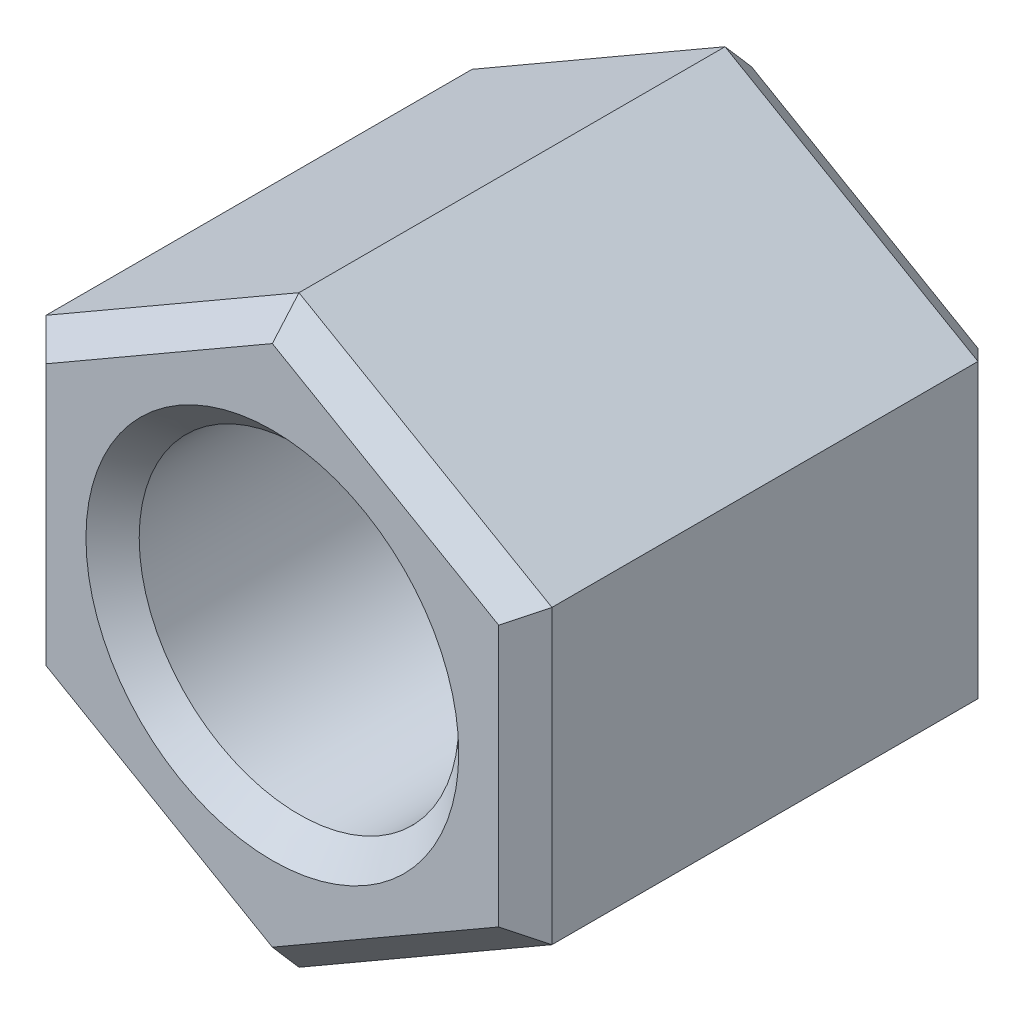
ISO-10303-21;
HEADER;
FILE_DESCRIPTION(('STEP AP214'),'2;1');
FILE_NAME('part.step','',(''),(''),'','','');
FILE_SCHEMA(('AUTOMOTIVE_DESIGN { 1 0 10303 214 1 1 1 1 }'));
ENDSEC;
DATA;
#1=APPLICATION_CONTEXT('core data for automotive mechanical design processes');
#2=APPLICATION_PROTOCOL_DEFINITION('international standard','automotive_design',2000,#1);
#3=PRODUCT_CONTEXT('',#1,'mechanical');
#4=PRODUCT('Part','Part','',(#3));
#5=PRODUCT_RELATED_PRODUCT_CATEGORY('part','',(#4));
#6=PRODUCT_DEFINITION_FORMATION('','',#4);
#7=PRODUCT_DEFINITION_CONTEXT('part definition',#1,'design');
#8=PRODUCT_DEFINITION('design','',#6,#7);
#9=PRODUCT_DEFINITION_SHAPE('','',#8);
#10=(LENGTH_UNIT() NAMED_UNIT(*) SI_UNIT(.MILLI.,.METRE.));
#11=(NAMED_UNIT(*) PLANE_ANGLE_UNIT() SI_UNIT($,.RADIAN.));
#12=(NAMED_UNIT(*) SI_UNIT($,.STERADIAN.) SOLID_ANGLE_UNIT());
#13=UNCERTAINTY_MEASURE_WITH_UNIT(LENGTH_MEASURE(1.E-05),#10,'distance_accuracy_value','');
#14=(GEOMETRIC_REPRESENTATION_CONTEXT(3) GLOBAL_UNCERTAINTY_ASSIGNED_CONTEXT((#13)) GLOBAL_UNIT_ASSIGNED_CONTEXT((#10,
#11,#12)) REPRESENTATION_CONTEXT('',''));
#15=CARTESIAN_POINT('',(0.,0.,0.));
#16=DIRECTION('',(0.,0.,1.));
#17=DIRECTION('',(1.,0.,0.));
#18=AXIS2_PLACEMENT_3D('',#15,#16,#17);
#19=CARTESIAN_POINT('',(0.,0.,18.));
#20=DIRECTION('',(0.,0.,1.));
#21=DIRECTION('',(1.,0.,0.));
#22=AXIS2_PLACEMENT_3D('',#19,#20,#21);
#23=PLANE('',#22);
#24=CARTESIAN_POINT('',(0.,0.,18.));
#25=DIRECTION('',(0.,0.,1.));
#26=DIRECTION('',(1.,0.,0.));
#27=AXIS2_PLACEMENT_3D('',#24,#25,#26);
#28=CIRCLE('',#27,6.99999999999999);
#29=CARTESIAN_POINT('',(6.99999999999999,0.,18.));
#30=VERTEX_POINT('',#29);
#31=EDGE_CURVE('E11',#30,#30,#28,.F.);
#32=ORIENTED_EDGE('',*,*,#31,.T.);
#33=EDGE_LOOP('',(#32));
#34=FACE_BOUND('',#33,.T.);
#35=DIRECTION('',(0.,1.,0.));
#36=VECTOR('',#35,1.);
#37=CARTESIAN_POINT('',(8.49999999999998,5.48482755730153,18.));
#38=LINE('',#37,#36);
#39=CARTESIAN_POINT('',(8.49999999999998,-4.90747728811175,18.));
#40=VERTEX_POINT('',#39);
#41=CARTESIAN_POINT('',(8.49999999999998,4.9074772881119,18.));
#42=VERTEX_POINT('',#41);
#43=EDGE_CURVE('E55',#40,#42,#38,.T.);
#44=ORIENTED_EDGE('',*,*,#43,.T.);
#45=DIRECTION('',(-0.86602540378444,0.499999999999997,0.));
#46=VECTOR('',#45,1.);
#47=CARTESIAN_POINT('',(-0.500000000000042,10.1036297108185,18.));
#48=LINE('',#47,#46);
#49=CARTESIAN_POINT('',(0.,9.8149545762237,18.));
#50=VERTEX_POINT('',#49);
#51=EDGE_CURVE('E47',#42,#50,#48,.T.);
#52=ORIENTED_EDGE('',*,*,#51,.T.);
#53=DIRECTION('',(-0.86602540378444,-0.499999999999997,0.));
#54=VECTOR('',#53,1.);
#55=CARTESIAN_POINT('',(-9.00000000000007,4.61880215351709,18.));
#56=LINE('',#55,#54);
#57=CARTESIAN_POINT('',(-8.50000000000007,4.9074772881119,18.));
#58=VERTEX_POINT('',#57);
#59=EDGE_CURVE('E194',#50,#58,#56,.T.);
#60=ORIENTED_EDGE('',*,*,#59,.T.);
#61=DIRECTION('',(0.,-1.,0.));
#62=VECTOR('',#61,1.);
#63=CARTESIAN_POINT('',(-8.50000000000007,-5.48482755730153,18.));
#64=LINE('',#63,#62);
#65=CARTESIAN_POINT('',(-8.50000000000007,-4.9074772881119,18.));
#66=VERTEX_POINT('',#65);
#67=EDGE_CURVE('E196',#58,#66,#64,.T.);
#68=ORIENTED_EDGE('',*,*,#67,.T.);
#69=DIRECTION('',(0.86602540378444,-0.499999999999997,0.));
#70=VECTOR('',#69,1.);
#71=CARTESIAN_POINT('',(0.499999999999952,-10.1036297108185,18.));
#72=LINE('',#71,#70);
#73=CARTESIAN_POINT('',(0.,-9.81495457622369,18.));
#74=VERTEX_POINT('',#73);
#75=EDGE_CURVE('E198',#66,#74,#72,.T.);
#76=ORIENTED_EDGE('',*,*,#75,.T.);
#77=DIRECTION('',(0.866025403784434,0.500000000000008,0.));
#78=VECTOR('',#77,1.);
#79=CARTESIAN_POINT('',(8.99999999999997,-4.61880215351694,18.));
#80=LINE('',#79,#78);
#81=EDGE_CURVE('E60',#74,#40,#80,.T.);
#82=ORIENTED_EDGE('',*,*,#81,.T.);
#83=EDGE_LOOP('',(#44,#52,#60,#68,#76,#82));
#84=FACE_BOUND('',#83,.T.);
#85=ADVANCED_FACE('F38',(#34,#84),#23,.T.);
#86=CARTESIAN_POINT('',(0.,0.,0.));
#87=DIRECTION('',(0.,0.,1.));
#88=DIRECTION('',(1.,0.,0.));
#89=AXIS2_PLACEMENT_3D('',#86,#87,#88);
#90=PLANE('',#89);
#91=CARTESIAN_POINT('',(0.,0.,0.));
#92=DIRECTION('',(0.,0.,1.));
#93=DIRECTION('',(1.,0.,0.));
#94=AXIS2_PLACEMENT_3D('',#91,#92,#93);
#95=CIRCLE('',#94,7.);
#96=CARTESIAN_POINT('',(7.,0.,0.));
#97=VERTEX_POINT('',#96);
#98=EDGE_CURVE('E156',#97,#97,#95,.T.);
#99=ORIENTED_EDGE('',*,*,#98,.T.);
#100=EDGE_LOOP('',(#99));
#101=FACE_BOUND('',#100,.T.);
#102=DIRECTION('',(-0.86602540378444,0.499999999999997,0.));
#103=VECTOR('',#102,1.);
#104=CARTESIAN_POINT('',(-4.25000000000002,-7.36121593216782,0.));
#105=LINE('',#104,#103);
#106=CARTESIAN_POINT('',(0.,-9.81495457622369,0.));
#107=VERTEX_POINT('',#106);
#108=CARTESIAN_POINT('',(-8.50000000000007,-4.9074772881119,0.));
#109=VERTEX_POINT('',#108);
#110=EDGE_CURVE('E155',#107,#109,#105,.T.);
#111=ORIENTED_EDGE('',*,*,#110,.T.);
#112=DIRECTION('',(0.,1.,0.));
#113=VECTOR('',#112,1.);
#114=CARTESIAN_POINT('',(-8.50000000000007,0.,0.));
#115=LINE('',#114,#113);
#116=CARTESIAN_POINT('',(-8.50000000000007,4.9074772881119,0.));
#117=VERTEX_POINT('',#116);
#118=EDGE_CURVE('E134',#109,#117,#115,.T.);
#119=ORIENTED_EDGE('',*,*,#118,.T.);
#120=DIRECTION('',(0.86602540378444,0.499999999999997,0.));
#121=VECTOR('',#120,1.);
#122=CARTESIAN_POINT('',(-4.25000000000002,7.36121593216782,0.));
#123=LINE('',#122,#121);
#124=CARTESIAN_POINT('',(0.,9.81495457622369,0.));
#125=VERTEX_POINT('',#124);
#126=EDGE_CURVE('E144',#117,#125,#123,.T.);
#127=ORIENTED_EDGE('',*,*,#126,.T.);
#128=DIRECTION('',(0.86602540378444,-0.499999999999997,0.));
#129=VECTOR('',#128,1.);
#130=CARTESIAN_POINT('',(4.25,7.36121593216778,0.));
#131=LINE('',#130,#129);
#132=CARTESIAN_POINT('',(8.49999999999998,4.9074772881119,0.));
#133=VERTEX_POINT('',#132);
#134=EDGE_CURVE('E150',#125,#133,#131,.T.);
#135=ORIENTED_EDGE('',*,*,#134,.T.);
#136=DIRECTION('',(0.,-1.,0.));
#137=VECTOR('',#136,1.);
#138=CARTESIAN_POINT('',(8.49999999999998,0.,0.));
#139=LINE('',#138,#137);
#140=CARTESIAN_POINT('',(8.49999999999998,-4.90747728811175,0.));
#141=VERTEX_POINT('',#140);
#142=EDGE_CURVE('E256',#133,#141,#139,.T.);
#143=ORIENTED_EDGE('',*,*,#142,.T.);
#144=DIRECTION('',(-0.866025403784434,-0.500000000000008,0.));
#145=VECTOR('',#144,1.);
#146=CARTESIAN_POINT('',(4.25000000000006,-7.36121593216767,0.));
#147=LINE('',#146,#145);
#148=EDGE_CURVE('E161',#141,#107,#147,.T.);
#149=ORIENTED_EDGE('',*,*,#148,.T.);
#150=EDGE_LOOP('',(#111,#119,#127,#135,#143,#149));
#151=FACE_BOUND('',#150,.T.);
#152=ADVANCED_FACE('F153',(#101,#151),#90,.F.);
#153=CARTESIAN_POINT('',(-9.50000000000007,5.48482755730153,18.));
#154=DIRECTION('',(0.499999999999997,-0.86602540378444,0.));
#155=DIRECTION('',(0.86602540378444,0.499999999999997,0.));
#156=AXIS2_PLACEMENT_3D('',#153,#154,#155);
#157=PLANE('',#156);
#158=DIRECTION('',(0.,0.,-1.));
#159=VECTOR('',#158,1.);
#160=CARTESIAN_POINT('',(0.,10.9696551146029,18.));
#161=LINE('',#160,#159);
#162=CARTESIAN_POINT('',(0.,10.9696551146029,17.));
#163=VERTEX_POINT('',#162);
#164=CARTESIAN_POINT('',(0.,10.9696551146029,0.999999999999997));
#165=VERTEX_POINT('',#164);
#166=EDGE_CURVE('E213',#163,#165,#161,.T.);
#167=ORIENTED_EDGE('',*,*,#166,.T.);
#168=DIRECTION('',(-0.86602540378444,-0.499999999999997,0.));
#169=VECTOR('',#168,1.);
#170=CARTESIAN_POINT('',(-9.50000000000007,5.48482755730153,0.999999999999997));
#171=LINE('',#170,#169);
#172=CARTESIAN_POINT('',(-9.50000000000007,5.48482755730153,0.999999999999997));
#173=VERTEX_POINT('',#172);
#174=EDGE_CURVE('E192',#165,#173,#171,.T.);
#175=ORIENTED_EDGE('',*,*,#174,.T.);
#176=DIRECTION('',(0.,0.,-1.));
#177=VECTOR('',#176,1.);
#178=CARTESIAN_POINT('',(-9.50000000000007,5.48482755730153,18.));
#179=LINE('',#178,#177);
#180=CARTESIAN_POINT('',(-9.50000000000007,5.48482755730153,17.));
#181=VERTEX_POINT('',#180);
#182=EDGE_CURVE('E151',#181,#173,#179,.T.);
#183=ORIENTED_EDGE('',*,*,#182,.F.);
#184=DIRECTION('',(0.86602540378444,0.499999999999997,0.));
#185=VECTOR('',#184,1.);
#186=CARTESIAN_POINT('',(0.,10.9696551146029,17.));
#187=LINE('',#186,#185);
#188=EDGE_CURVE('E190',#181,#163,#187,.T.);
#189=ORIENTED_EDGE('',*,*,#188,.T.);
#190=EDGE_LOOP('',(#167,#175,#183,#189));
#191=FACE_BOUND('',#190,.T.);
#192=ADVANCED_FACE('F280',(#191),#157,.F.);
#193=CARTESIAN_POINT('',(-9.50000000000007,-5.48482755730153,18.));
#194=DIRECTION('',(1.,0.,0.));
#195=DIRECTION('',(0.,0.,-1.));
#196=AXIS2_PLACEMENT_3D('',#193,#194,#195);
#197=PLANE('',#196);
#198=ORIENTED_EDGE('',*,*,#182,.T.);
#199=DIRECTION('',(0.,-1.,0.));
#200=VECTOR('',#199,1.);
#201=CARTESIAN_POINT('',(-9.50000000000007,-5.48482755730153,0.999999999999997));
#202=LINE('',#201,#200);
#203=CARTESIAN_POINT('',(-9.50000000000007,-5.48482755730153,0.999999999999997));
#204=VERTEX_POINT('',#203);
#205=EDGE_CURVE('E137',#173,#204,#202,.T.);
#206=ORIENTED_EDGE('',*,*,#205,.T.);
#207=DIRECTION('',(0.,0.,-1.));
#208=VECTOR('',#207,1.);
#209=CARTESIAN_POINT('',(-9.50000000000007,-5.48482755730153,18.));
#210=LINE('',#209,#208);
#211=CARTESIAN_POINT('',(-9.50000000000007,-5.48482755730153,17.));
#212=VERTEX_POINT('',#211);
#213=EDGE_CURVE('E242',#212,#204,#210,.T.);
#214=ORIENTED_EDGE('',*,*,#213,.F.);
#215=DIRECTION('',(0.,1.,0.));
#216=VECTOR('',#215,1.);
#217=CARTESIAN_POINT('',(-9.50000000000007,5.48482755730153,17.));
#218=LINE('',#217,#216);
#219=EDGE_CURVE('E170',#212,#181,#218,.T.);
#220=ORIENTED_EDGE('',*,*,#219,.T.);
#221=EDGE_LOOP('',(#198,#206,#214,#220));
#222=FACE_BOUND('',#221,.T.);
#223=ADVANCED_FACE('F247',(#222),#197,.F.);
#224=CARTESIAN_POINT('',(-9.50000000000007,-5.48482755730153,18.));
#225=DIRECTION('',(0.499999999999997,0.86602540378444,0.));
#226=DIRECTION('',(-0.86602540378444,0.499999999999997,0.));
#227=AXIS2_PLACEMENT_3D('',#224,#225,#226);
#228=PLANE('',#227);
#229=ORIENTED_EDGE('',*,*,#213,.T.);
#230=DIRECTION('',(0.86602540378444,-0.499999999999997,0.));
#231=VECTOR('',#230,1.);
#232=CARTESIAN_POINT('',(-9.50000000000007,-5.48482755730153,0.999999999999997));
#233=LINE('',#232,#231);
#234=CARTESIAN_POINT('',(0.,-10.9696551146029,0.999999999999997));
#235=VERTEX_POINT('',#234);
#236=EDGE_CURVE('E175',#204,#235,#233,.T.);
#237=ORIENTED_EDGE('',*,*,#236,.T.);
#238=DIRECTION('',(0.,0.,-1.));
#239=VECTOR('',#238,1.);
#240=CARTESIAN_POINT('',(0.,-10.9696551146029,18.));
#241=LINE('',#240,#239);
#242=CARTESIAN_POINT('',(0.,-10.9696551146029,17.));
#243=VERTEX_POINT('',#242);
#244=EDGE_CURVE('E244',#243,#235,#241,.T.);
#245=ORIENTED_EDGE('',*,*,#244,.F.);
#246=DIRECTION('',(-0.86602540378444,0.499999999999997,0.));
#247=VECTOR('',#246,1.);
#248=CARTESIAN_POINT('',(-9.50000000000007,-5.48482755730153,17.));
#249=LINE('',#248,#247);
#250=EDGE_CURVE('E173',#243,#212,#249,.T.);
#251=ORIENTED_EDGE('',*,*,#250,.T.);
#252=EDGE_LOOP('',(#229,#237,#245,#251));
#253=FACE_BOUND('',#252,.T.);
#254=ADVANCED_FACE('F241',(#253),#228,.F.);
#255=CARTESIAN_POINT('',(9.49999999999998,-5.48482755730137,18.));
#256=DIRECTION('',(-0.500000000000008,0.866025403784434,0.));
#257=DIRECTION('',(-0.866025403784434,-0.500000000000008,0.));
#258=AXIS2_PLACEMENT_3D('',#255,#256,#257);
#259=PLANE('',#258);
#260=ORIENTED_EDGE('',*,*,#244,.T.);
#261=DIRECTION('',(0.866025403784434,0.500000000000008,0.));
#262=VECTOR('',#261,1.);
#263=CARTESIAN_POINT('',(9.49999999999998,-5.48482755730137,0.999999999999997));
#264=LINE('',#263,#262);
#265=CARTESIAN_POINT('',(9.49999999999998,-5.48482755730137,0.999999999999997));
#266=VERTEX_POINT('',#265);
#267=EDGE_CURVE('E179',#235,#266,#264,.T.);
#268=ORIENTED_EDGE('',*,*,#267,.T.);
#269=DIRECTION('',(0.,0.,-1.));
#270=VECTOR('',#269,1.);
#271=CARTESIAN_POINT('',(9.49999999999998,-5.48482755730137,18.));
#272=LINE('',#271,#270);
#273=CARTESIAN_POINT('',(9.49999999999998,-5.48482755730137,17.));
#274=VERTEX_POINT('',#273);
#275=EDGE_CURVE('E251',#274,#266,#272,.T.);
#276=ORIENTED_EDGE('',*,*,#275,.F.);
#277=DIRECTION('',(-0.866025403784434,-0.500000000000008,0.));
#278=VECTOR('',#277,1.);
#279=CARTESIAN_POINT('',(0.,-10.9696551146029,17.));
#280=LINE('',#279,#278);
#281=EDGE_CURVE('E177',#274,#243,#280,.T.);
#282=ORIENTED_EDGE('',*,*,#281,.T.);
#283=EDGE_LOOP('',(#260,#268,#276,#282));
#284=FACE_BOUND('',#283,.T.);
#285=ADVANCED_FACE('F268',(#284),#259,.F.);
#286=CARTESIAN_POINT('',(9.49999999999998,-5.48482755730137,18.));
#287=DIRECTION('',(-1.,0.,0.));
#288=DIRECTION('',(0.,-1.,0.));
#289=AXIS2_PLACEMENT_3D('',#286,#287,#288);
#290=PLANE('',#289);
#291=ORIENTED_EDGE('',*,*,#275,.T.);
#292=DIRECTION('',(0.,1.,0.));
#293=VECTOR('',#292,1.);
#294=CARTESIAN_POINT('',(9.49999999999998,-5.48482755730137,0.999999999999997));
#295=LINE('',#294,#293);
#296=CARTESIAN_POINT('',(9.49999999999998,5.48482755730153,0.999999999999997));
#297=VERTEX_POINT('',#296);
#298=EDGE_CURVE('E183',#266,#297,#295,.T.);
#299=ORIENTED_EDGE('',*,*,#298,.T.);
#300=DIRECTION('',(0.,0.,-1.));
#301=VECTOR('',#300,1.);
#302=CARTESIAN_POINT('',(9.49999999999998,5.48482755730153,18.));
#303=LINE('',#302,#301);
#304=CARTESIAN_POINT('',(9.49999999999998,5.48482755730153,17.));
#305=VERTEX_POINT('',#304);
#306=EDGE_CURVE('E273',#305,#297,#303,.T.);
#307=ORIENTED_EDGE('',*,*,#306,.F.);
#308=DIRECTION('',(0.,-1.,0.));
#309=VECTOR('',#308,1.);
#310=CARTESIAN_POINT('',(9.49999999999998,-5.48482755730137,17.));
#311=LINE('',#310,#309);
#312=EDGE_CURVE('E181',#305,#274,#311,.T.);
#313=ORIENTED_EDGE('',*,*,#312,.T.);
#314=EDGE_LOOP('',(#291,#299,#307,#313));
#315=FACE_BOUND('',#314,.T.);
#316=ADVANCED_FACE('F291',(#315),#290,.F.);
#317=CARTESIAN_POINT('',(9.49999999999998,5.48482755730153,18.));
#318=DIRECTION('',(-0.499999999999997,-0.86602540378444,0.));
#319=DIRECTION('',(0.86602540378444,-0.499999999999997,0.));
#320=AXIS2_PLACEMENT_3D('',#317,#318,#319);
#321=PLANE('',#320);
#322=ORIENTED_EDGE('',*,*,#306,.T.);
#323=DIRECTION('',(-0.86602540378444,0.499999999999997,0.));
#324=VECTOR('',#323,1.);
#325=CARTESIAN_POINT('',(9.49999999999998,5.48482755730153,0.999999999999997));
#326=LINE('',#325,#324);
#327=EDGE_CURVE('E188',#297,#165,#326,.T.);
#328=ORIENTED_EDGE('',*,*,#327,.T.);
#329=ORIENTED_EDGE('',*,*,#166,.F.);
#330=DIRECTION('',(0.86602540378444,-0.499999999999997,0.));
#331=VECTOR('',#330,1.);
#332=CARTESIAN_POINT('',(9.49999999999998,5.48482755730153,17.));
#333=LINE('',#332,#331);
#334=EDGE_CURVE('E185',#163,#305,#333,.T.);
#335=ORIENTED_EDGE('',*,*,#334,.T.);
#336=EDGE_LOOP('',(#322,#328,#329,#335));
#337=FACE_BOUND('',#336,.T.);
#338=ADVANCED_FACE('F292',(#337),#321,.F.);
#339=CARTESIAN_POINT('',(0.,0.,18.));
#340=DIRECTION('',(0.,0.,-1.));
#341=DIRECTION('',(-1.,0.,0.));
#342=AXIS2_PLACEMENT_3D('',#339,#340,#341);
#343=CYLINDRICAL_SURFACE('',#342,6.);
#344=CARTESIAN_POINT('',(0.,0.,1.00000000000001));
#345=DIRECTION('',(0.,0.,1.));
#346=DIRECTION('',(1.,0.,0.));
#347=AXIS2_PLACEMENT_3D('',#344,#345,#346);
#348=CIRCLE('',#347,6.);
#349=CARTESIAN_POINT('',(6.,0.,1.00000000000001));
#350=VERTEX_POINT('',#349);
#351=EDGE_CURVE('E167',#350,#350,#348,.F.);
#352=ORIENTED_EDGE('',*,*,#351,.T.);
#353=EDGE_LOOP('',(#352));
#354=FACE_BOUND('',#353,.T.);
#355=CARTESIAN_POINT('',(0.,0.,17.));
#356=DIRECTION('',(0.,0.,1.));
#357=DIRECTION('',(1.,0.,0.));
#358=AXIS2_PLACEMENT_3D('',#355,#356,#357);
#359=CIRCLE('',#358,6.);
#360=CARTESIAN_POINT('',(6.,0.,17.));
#361=VERTEX_POINT('',#360);
#362=EDGE_CURVE('E159',#361,#361,#359,.T.);
#363=ORIENTED_EDGE('',*,*,#362,.T.);
#364=EDGE_LOOP('',(#363));
#365=FACE_BOUND('',#364,.T.);
#366=ADVANCED_FACE('F311',(#354,#365),#343,.F.);
#367=CARTESIAN_POINT('',(0.,0.,0.));
#368=DIRECTION('',(0.,0.,-1.));
#369=DIRECTION('',(-1.,0.,0.));
#370=AXIS2_PLACEMENT_3D('',#367,#368,#369);
#371=CONICAL_SURFACE('',#370,7.,0.785398163397445);
#372=ORIENTED_EDGE('',*,*,#351,.F.);
#373=EDGE_LOOP('',(#372));
#374=FACE_BOUND('',#373,.T.);
#375=ORIENTED_EDGE('',*,*,#98,.F.);
#376=EDGE_LOOP('',(#375));
#377=FACE_BOUND('',#376,.T.);
#378=ADVANCED_FACE('F325',(#374,#377),#371,.F.);
#379=CARTESIAN_POINT('',(9.49999999999998,-5.48482755730137,0.999999999999997));
#380=DIRECTION('',(-0.707106781186546,0.,0.707106781186549));
#381=DIRECTION('',(0.,1.,0.));
#382=AXIS2_PLACEMENT_3D('',#379,#380,#381);
#383=PLANE('',#382);
#384=DIRECTION('',(-0.65465367070798,0.377964473009223,-0.654653670707976));
#385=VECTOR('',#384,1.);
#386=CARTESIAN_POINT('',(9.49999999999998,-5.48482755730137,0.999999999999997));
#387=LINE('',#386,#385);
#388=EDGE_CURVE('E207',#141,#266,#387,.F.);
#389=ORIENTED_EDGE('',*,*,#388,.F.);
#390=ORIENTED_EDGE('',*,*,#142,.F.);
#391=DIRECTION('',(-0.654653670707978,-0.377964473009229,-0.654653670707975));
#392=VECTOR('',#391,1.);
#393=CARTESIAN_POINT('',(9.49999999999998,5.48482755730153,0.999999999999997));
#394=LINE('',#393,#392);
#395=EDGE_CURVE('E210',#297,#133,#394,.T.);
#396=ORIENTED_EDGE('',*,*,#395,.F.);
#397=ORIENTED_EDGE('',*,*,#298,.F.);
#398=EDGE_LOOP('',(#389,#390,#396,#397));
#399=FACE_BOUND('',#398,.T.);
#400=ADVANCED_FACE('F289',(#399),#383,.F.);
#401=CARTESIAN_POINT('',(9.49999999999998,5.48482755730153,0.999999999999997));
#402=DIRECTION('',(-0.353553390593271,-0.612372435695794,0.707106781186549));
#403=DIRECTION('',(-0.86602540378444,0.499999999999997,0.));
#404=AXIS2_PLACEMENT_3D('',#401,#402,#403);
#405=PLANE('',#404);
#406=ORIENTED_EDGE('',*,*,#395,.T.);
#407=ORIENTED_EDGE('',*,*,#134,.F.);
#408=DIRECTION('',(0.,-0.755928946018456,-0.654653670707976));
#409=VECTOR('',#408,1.);
#410=CARTESIAN_POINT('',(0.,7.83546793900213,-1.7142857142857));
#411=LINE('',#410,#409);
#412=EDGE_CURVE('E147',#165,#125,#411,.T.);
#413=ORIENTED_EDGE('',*,*,#412,.F.);
#414=ORIENTED_EDGE('',*,*,#327,.F.);
#415=EDGE_LOOP('',(#406,#407,#413,#414));
#416=FACE_BOUND('',#415,.T.);
#417=ADVANCED_FACE('F286',(#416),#405,.F.);
#418=CARTESIAN_POINT('',(9.49999999999998,-5.48482755730137,0.999999999999997));
#419=DIRECTION('',(-0.353553390593279,0.61237243569579,0.707106781186549));
#420=DIRECTION('',(0.866025403784434,0.500000000000008,0.));
#421=AXIS2_PLACEMENT_3D('',#418,#419,#420);
#422=PLANE('',#421);
#423=ORIENTED_EDGE('',*,*,#388,.T.);
#424=ORIENTED_EDGE('',*,*,#267,.F.);
#425=DIRECTION('',(0.,0.755928946018457,-0.654653670707975));
#426=VECTOR('',#425,1.);
#427=CARTESIAN_POINT('',(0.,-7.83546793900205,-1.71428571428576));
#428=LINE('',#427,#426);
#429=EDGE_CURVE('E140',#107,#235,#428,.F.);
#430=ORIENTED_EDGE('',*,*,#429,.F.);
#431=ORIENTED_EDGE('',*,*,#148,.F.);
#432=EDGE_LOOP('',(#423,#424,#430,#431));
#433=FACE_BOUND('',#432,.T.);
#434=ADVANCED_FACE('F263',(#433),#422,.F.);
#435=CARTESIAN_POINT('',(-9.50000000000007,5.48482755730153,0.999999999999997));
#436=DIRECTION('',(0.353553390593271,-0.612372435695794,0.70710678118655));
#437=DIRECTION('',(-0.86602540378444,-0.499999999999997,0.));
#438=AXIS2_PLACEMENT_3D('',#435,#436,#437);
#439=PLANE('',#438);
#440=ORIENTED_EDGE('',*,*,#412,.T.);
#441=ORIENTED_EDGE('',*,*,#126,.F.);
#442=DIRECTION('',(-0.654653670707978,0.37796447300923,0.654653670707975));
#443=VECTOR('',#442,1.);
#444=CARTESIAN_POINT('',(-9.50000000000007,5.48482755730153,0.999999999999997));
#445=LINE('',#444,#443);
#446=EDGE_CURVE('E130',#173,#117,#445,.F.);
#447=ORIENTED_EDGE('',*,*,#446,.F.);
#448=ORIENTED_EDGE('',*,*,#174,.F.);
#449=EDGE_LOOP('',(#440,#441,#447,#448));
#450=FACE_BOUND('',#449,.T.);
#451=ADVANCED_FACE('F145',(#450),#439,.F.);
#452=CARTESIAN_POINT('',(-9.50000000000007,-5.48482755730153,0.999999999999997));
#453=DIRECTION('',(0.353553390593271,0.612372435695794,0.70710678118655));
#454=DIRECTION('',(0.86602540378444,-0.499999999999997,0.));
#455=AXIS2_PLACEMENT_3D('',#452,#453,#454);
#456=PLANE('',#455);
#457=ORIENTED_EDGE('',*,*,#429,.T.);
#458=ORIENTED_EDGE('',*,*,#236,.F.);
#459=DIRECTION('',(0.654653670707978,0.37796447300923,-0.654653670707975));
#460=VECTOR('',#459,1.);
#461=CARTESIAN_POINT('',(-9.50000000000007,-5.48482755730153,0.999999999999997));
#462=LINE('',#461,#460);
#463=EDGE_CURVE('E141',#109,#204,#462,.F.);
#464=ORIENTED_EDGE('',*,*,#463,.F.);
#465=ORIENTED_EDGE('',*,*,#110,.F.);
#466=EDGE_LOOP('',(#457,#458,#464,#465));
#467=FACE_BOUND('',#466,.T.);
#468=ADVANCED_FACE('F266',(#467),#456,.F.);
#469=CARTESIAN_POINT('',(-9.50000000000007,-5.48482755730153,0.999999999999997));
#470=DIRECTION('',(0.707106781186546,0.,0.707106781186549));
#471=DIRECTION('',(0.,-1.,0.));
#472=AXIS2_PLACEMENT_3D('',#469,#470,#471);
#473=PLANE('',#472);
#474=ORIENTED_EDGE('',*,*,#446,.T.);
#475=ORIENTED_EDGE('',*,*,#118,.F.);
#476=ORIENTED_EDGE('',*,*,#463,.T.);
#477=ORIENTED_EDGE('',*,*,#205,.F.);
#478=EDGE_LOOP('',(#474,#475,#476,#477));
#479=FACE_BOUND('',#478,.T.);
#480=ADVANCED_FACE('F132',(#479),#473,.F.);
#481=CARTESIAN_POINT('',(0.,0.,17.));
#482=DIRECTION('',(0.,0.,1.));
#483=DIRECTION('',(1.,0.,0.));
#484=AXIS2_PLACEMENT_3D('',#481,#482,#483);
#485=CONICAL_SURFACE('',#484,6.,0.785398163397449);
#486=ORIENTED_EDGE('',*,*,#31,.F.);
#487=EDGE_LOOP('',(#486));
#488=FACE_BOUND('',#487,.T.);
#489=ORIENTED_EDGE('',*,*,#362,.F.);
#490=EDGE_LOOP('',(#489));
#491=FACE_BOUND('',#490,.T.);
#492=ADVANCED_FACE('F331',(#488,#491),#485,.F.);
#493=CARTESIAN_POINT('',(-4.25000000000002,-7.36121593216782,18.));
#494=DIRECTION('',(-0.353553390593273,-0.612372435695797,0.707106781186546));
#495=DIRECTION('',(-0.86602540378444,0.499999999999997,0.));
#496=AXIS2_PLACEMENT_3D('',#493,#494,#495);
#497=PLANE('',#496);
#498=DIRECTION('',(0.654653670707975,0.377964473009228,0.654653670707979));
#499=VECTOR('',#498,1.);
#500=CARTESIAN_POINT('',(-7.28571428571434,-4.20640910409591,19.2142857142857));
#501=LINE('',#500,#499);
#502=EDGE_CURVE('E223',#212,#66,#501,.T.);
#503=ORIENTED_EDGE('',*,*,#502,.F.);
#504=ORIENTED_EDGE('',*,*,#250,.F.);
#505=DIRECTION('',(0.,0.755928946018453,0.654653670707978));
#506=VECTOR('',#505,1.);
#507=CARTESIAN_POINT('',(0.,-8.41281820819176,19.2142857142857));
#508=LINE('',#507,#506);
#509=EDGE_CURVE('E42',#74,#243,#508,.F.);
#510=ORIENTED_EDGE('',*,*,#509,.F.);
#511=ORIENTED_EDGE('',*,*,#75,.F.);
#512=EDGE_LOOP('',(#503,#504,#510,#511));
#513=FACE_BOUND('',#512,.T.);
#514=ADVANCED_FACE('F40',(#513),#497,.T.);
#515=CARTESIAN_POINT('',(4.25000000000006,-7.36121593216767,18.));
#516=DIRECTION('',(0.353553390593281,-0.612372435695793,0.707106781186545));
#517=DIRECTION('',(-0.866025403784434,-0.500000000000008,0.));
#518=AXIS2_PLACEMENT_3D('',#515,#516,#517);
#519=PLANE('',#518);
#520=ORIENTED_EDGE('',*,*,#509,.T.);
#521=ORIENTED_EDGE('',*,*,#281,.F.);
#522=DIRECTION('',(-0.654653670707977,0.377964473009222,0.65465367070798));
#523=VECTOR('',#522,1.);
#524=CARTESIAN_POINT('',(7.28571428571429,-4.2064091040958,19.2142857142857));
#525=LINE('',#524,#523);
#526=EDGE_CURVE('E221',#40,#274,#525,.F.);
#527=ORIENTED_EDGE('',*,*,#526,.F.);
#528=ORIENTED_EDGE('',*,*,#81,.F.);
#529=EDGE_LOOP('',(#520,#521,#527,#528));
#530=FACE_BOUND('',#529,.T.);
#531=ADVANCED_FACE('F233',(#530),#519,.T.);
#532=CARTESIAN_POINT('',(-8.50000000000007,0.,18.));
#533=DIRECTION('',(-0.707106781186549,0.,0.707106781186546));
#534=DIRECTION('',(0.,1.,0.));
#535=AXIS2_PLACEMENT_3D('',#532,#533,#534);
#536=PLANE('',#535);
#537=ORIENTED_EDGE('',*,*,#502,.T.);
#538=ORIENTED_EDGE('',*,*,#67,.F.);
#539=DIRECTION('',(0.654653670707975,-0.377964473009228,0.654653670707979));
#540=VECTOR('',#539,1.);
#541=CARTESIAN_POINT('',(-7.28571428571435,4.20640910409592,19.2142857142857));
#542=LINE('',#541,#540);
#543=EDGE_CURVE('E218',#181,#58,#542,.T.);
#544=ORIENTED_EDGE('',*,*,#543,.F.);
#545=ORIENTED_EDGE('',*,*,#219,.F.);
#546=EDGE_LOOP('',(#537,#538,#544,#545));
#547=FACE_BOUND('',#546,.T.);
#548=ADVANCED_FACE('F352',(#547),#536,.T.);
#549=CARTESIAN_POINT('',(8.49999999999998,0.,18.));
#550=DIRECTION('',(0.707106781186549,0.,0.707106781186546));
#551=DIRECTION('',(0.,-1.,0.));
#552=AXIS2_PLACEMENT_3D('',#549,#550,#551);
#553=PLANE('',#552);
#554=ORIENTED_EDGE('',*,*,#526,.T.);
#555=ORIENTED_EDGE('',*,*,#312,.F.);
#556=DIRECTION('',(-0.654653670707975,-0.377964473009227,0.654653670707979));
#557=VECTOR('',#556,1.);
#558=CARTESIAN_POINT('',(7.28571428571425,4.20640910409592,19.2142857142857));
#559=LINE('',#558,#557);
#560=EDGE_CURVE('E216',#42,#305,#559,.F.);
#561=ORIENTED_EDGE('',*,*,#560,.F.);
#562=ORIENTED_EDGE('',*,*,#43,.F.);
#563=EDGE_LOOP('',(#554,#555,#561,#562));
#564=FACE_BOUND('',#563,.T.);
#565=ADVANCED_FACE('F349',(#564),#553,.T.);
#566=CARTESIAN_POINT('',(-4.25000000000002,7.36121593216782,18.));
#567=DIRECTION('',(-0.353553390593273,0.612372435695797,0.707106781186546));
#568=DIRECTION('',(0.86602540378444,0.499999999999997,0.));
#569=AXIS2_PLACEMENT_3D('',#566,#567,#568);
#570=PLANE('',#569);
#571=ORIENTED_EDGE('',*,*,#543,.T.);
#572=ORIENTED_EDGE('',*,*,#59,.F.);
#573=DIRECTION('',(0.,0.755928946018452,-0.65465367070798));
#574=VECTOR('',#573,1.);
#575=CARTESIAN_POINT('',(0.,8.41281820819178,19.2142857142857));
#576=LINE('',#575,#574);
#577=EDGE_CURVE('E214',#163,#50,#576,.F.);
#578=ORIENTED_EDGE('',*,*,#577,.F.);
#579=ORIENTED_EDGE('',*,*,#188,.F.);
#580=EDGE_LOOP('',(#571,#572,#578,#579));
#581=FACE_BOUND('',#580,.T.);
#582=ADVANCED_FACE('F300',(#581),#570,.T.);
#583=CARTESIAN_POINT('',(4.25,7.36121593216778,18.));
#584=DIRECTION('',(0.353553390593273,0.612372435695797,0.707106781186546));
#585=DIRECTION('',(0.86602540378444,-0.499999999999997,0.));
#586=AXIS2_PLACEMENT_3D('',#583,#584,#585);
#587=PLANE('',#586);
#588=ORIENTED_EDGE('',*,*,#560,.T.);
#589=ORIENTED_EDGE('',*,*,#334,.F.);
#590=ORIENTED_EDGE('',*,*,#577,.T.);
#591=ORIENTED_EDGE('',*,*,#51,.F.);
#592=EDGE_LOOP('',(#588,#589,#590,#591));
#593=FACE_BOUND('',#592,.T.);
#594=ADVANCED_FACE('F295',(#593),#587,.T.);
#595=CLOSED_SHELL('',(#85,#152,#192,#223,#254,#285,#316,#338,#366,#378,#400,#417,#434,#451,#468,
#480,#492,#514,#531,#548,#565,#582,#594));
#596=MANIFOLD_SOLID_BREP('B2',#595);
#597=ADVANCED_BREP_SHAPE_REPRESENTATION('',(#18,#596),#14);
#598=SHAPE_DEFINITION_REPRESENTATION(#9,#597);
ENDSEC;
END-ISO-10303-21;
